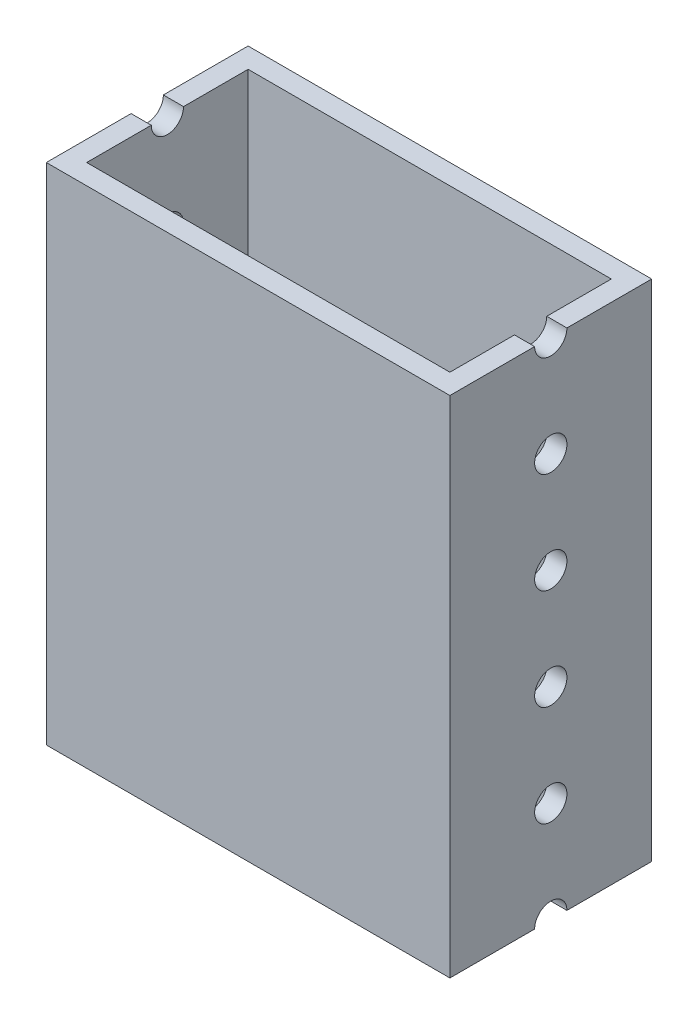
ISO-10303-21;
HEADER;
FILE_DESCRIPTION(('STEP AP214'),'2;1');
FILE_NAME('part.step','',(''),(''),'','','');
FILE_SCHEMA(('AUTOMOTIVE_DESIGN { 1 0 10303 214 1 1 1 1 }'));
ENDSEC;
DATA;
#1=APPLICATION_CONTEXT('core data for automotive mechanical design processes');
#2=APPLICATION_PROTOCOL_DEFINITION('international standard','automotive_design',2000,#1);
#3=PRODUCT_CONTEXT('',#1,'mechanical');
#4=PRODUCT('Part','Part','',(#3));
#5=PRODUCT_RELATED_PRODUCT_CATEGORY('part','',(#4));
#6=PRODUCT_DEFINITION_FORMATION('','',#4);
#7=PRODUCT_DEFINITION_CONTEXT('part definition',#1,'design');
#8=PRODUCT_DEFINITION('design','',#6,#7);
#9=PRODUCT_DEFINITION_SHAPE('','',#8);
#10=(LENGTH_UNIT() NAMED_UNIT(*) SI_UNIT(.MILLI.,.METRE.));
#11=(NAMED_UNIT(*) PLANE_ANGLE_UNIT() SI_UNIT($,.RADIAN.));
#12=(NAMED_UNIT(*) SI_UNIT($,.STERADIAN.) SOLID_ANGLE_UNIT());
#13=UNCERTAINTY_MEASURE_WITH_UNIT(LENGTH_MEASURE(1.E-05),#10,'distance_accuracy_value','');
#14=(GEOMETRIC_REPRESENTATION_CONTEXT(3) GLOBAL_UNCERTAINTY_ASSIGNED_CONTEXT((#13)) GLOBAL_UNIT_ASSIGNED_CONTEXT((#10,
#11,#12)) REPRESENTATION_CONTEXT('',''));
#15=CARTESIAN_POINT('',(0.,0.,0.));
#16=DIRECTION('',(0.,0.,1.));
#17=DIRECTION('',(1.,0.,0.));
#18=AXIS2_PLACEMENT_3D('',#15,#16,#17);
#19=CARTESIAN_POINT('',(25.4,635.,12.7));
#20=DIRECTION('',(-1.,0.,0.));
#21=DIRECTION('',(0.,0.,1.));
#22=AXIS2_PLACEMENT_3D('',#19,#20,#21);
#23=PLANE('',#22);
#24=CARTESIAN_POINT('',(25.4,50.8,0.));
#25=DIRECTION('',(1.,0.,0.));
#26=DIRECTION('',(0.,0.,-1.));
#27=AXIS2_PLACEMENT_3D('',#24,#25,#26);
#28=CIRCLE('',#27,2.032);
#29=CARTESIAN_POINT('',(25.4,50.8,-2.032));
#30=VERTEX_POINT('',#29);
#31=EDGE_CURVE('E302',#30,#30,#28,.T.);
#32=ORIENTED_EDGE('',*,*,#31,.F.);
#33=EDGE_LOOP('',(#32));
#34=FACE_BOUND('',#33,.T.);
#35=CARTESIAN_POINT('',(25.4,38.1,0.));
#36=DIRECTION('',(1.,0.,0.));
#37=DIRECTION('',(0.,0.,-1.));
#38=AXIS2_PLACEMENT_3D('',#35,#36,#37);
#39=CIRCLE('',#38,2.032);
#40=CARTESIAN_POINT('',(25.4,38.1,-2.032));
#41=VERTEX_POINT('',#40);
#42=EDGE_CURVE('E326',#41,#41,#39,.T.);
#43=ORIENTED_EDGE('',*,*,#42,.F.);
#44=EDGE_LOOP('',(#43));
#45=FACE_BOUND('',#44,.T.);
#46=CARTESIAN_POINT('',(25.4,25.4,0.));
#47=DIRECTION('',(1.,0.,0.));
#48=DIRECTION('',(0.,0.,-1.));
#49=AXIS2_PLACEMENT_3D('',#46,#47,#48);
#50=CIRCLE('',#49,2.032);
#51=CARTESIAN_POINT('',(25.4,25.4,-2.032));
#52=VERTEX_POINT('',#51);
#53=EDGE_CURVE('E320',#52,#52,#50,.T.);
#54=ORIENTED_EDGE('',*,*,#53,.F.);
#55=EDGE_LOOP('',(#54));
#56=FACE_BOUND('',#55,.T.);
#57=CARTESIAN_POINT('',(25.4,12.7,0.));
#58=DIRECTION('',(1.,0.,0.));
#59=DIRECTION('',(0.,0.,-1.));
#60=AXIS2_PLACEMENT_3D('',#57,#58,#59);
#61=CIRCLE('',#60,2.032);
#62=CARTESIAN_POINT('',(25.4,12.7,-2.032));
#63=VERTEX_POINT('',#62);
#64=EDGE_CURVE('E314',#63,#63,#61,.T.);
#65=ORIENTED_EDGE('',*,*,#64,.F.);
#66=EDGE_LOOP('',(#65));
#67=FACE_BOUND('',#66,.T.);
#68=DIRECTION('',(0.,0.,-1.));
#69=VECTOR('',#68,1.);
#70=CARTESIAN_POINT('',(25.4,63.5,12.7));
#71=LINE('',#70,#69);
#72=CARTESIAN_POINT('',(25.4,63.5,12.7));
#73=VERTEX_POINT('',#72);
#74=CARTESIAN_POINT('',(25.4,63.5,2.032));
#75=VERTEX_POINT('',#74);
#76=EDGE_CURVE('E144',#73,#75,#71,.T.);
#77=ORIENTED_EDGE('',*,*,#76,.F.);
#78=DIRECTION('',(0.,-1.,0.));
#79=VECTOR('',#78,1.);
#80=CARTESIAN_POINT('',(25.4,635.,12.7));
#81=LINE('',#80,#79);
#82=CARTESIAN_POINT('',(25.4,0.,12.7));
#83=VERTEX_POINT('',#82);
#84=EDGE_CURVE('E156',#73,#83,#81,.T.);
#85=ORIENTED_EDGE('',*,*,#84,.T.);
#86=DIRECTION('',(0.,0.,-1.));
#87=VECTOR('',#86,1.);
#88=CARTESIAN_POINT('',(25.4,0.,12.7));
#89=LINE('',#88,#87);
#90=CARTESIAN_POINT('',(25.4,0.,2.032));
#91=VERTEX_POINT('',#90);
#92=EDGE_CURVE('E264',#83,#91,#89,.T.);
#93=ORIENTED_EDGE('',*,*,#92,.T.);
#94=CARTESIAN_POINT('',(25.4,0.,0.));
#95=DIRECTION('',(1.,0.,0.));
#96=DIRECTION('',(0.,0.,-1.));
#97=AXIS2_PLACEMENT_3D('',#94,#95,#96);
#98=CIRCLE('',#97,2.032);
#99=CARTESIAN_POINT('',(25.4,0.,-2.032));
#100=VERTEX_POINT('',#99);
#101=EDGE_CURVE('E229',#100,#91,#98,.T.);
#102=ORIENTED_EDGE('',*,*,#101,.F.);
#103=CARTESIAN_POINT('',(25.4,0.,-12.7));
#104=VERTEX_POINT('',#103);
#105=EDGE_CURVE('E263',#100,#104,#89,.T.);
#106=ORIENTED_EDGE('',*,*,#105,.T.);
#107=DIRECTION('',(0.,-1.,0.));
#108=VECTOR('',#107,1.);
#109=CARTESIAN_POINT('',(25.4,635.,-12.7));
#110=LINE('',#109,#108);
#111=CARTESIAN_POINT('',(25.4,63.5,-12.7));
#112=VERTEX_POINT('',#111);
#113=EDGE_CURVE('E176',#112,#104,#110,.T.);
#114=ORIENTED_EDGE('',*,*,#113,.F.);
#115=CARTESIAN_POINT('',(25.4,63.5,-2.032));
#116=VERTEX_POINT('',#115);
#117=EDGE_CURVE('E151',#116,#112,#71,.T.);
#118=ORIENTED_EDGE('',*,*,#117,.F.);
#119=CARTESIAN_POINT('',(25.4,63.5,0.));
#120=DIRECTION('',(1.,0.,0.));
#121=DIRECTION('',(0.,0.,-1.));
#122=AXIS2_PLACEMENT_3D('',#119,#120,#121);
#123=CIRCLE('',#122,2.032);
#124=EDGE_CURVE('E160',#75,#116,#123,.T.);
#125=ORIENTED_EDGE('',*,*,#124,.F.);
#126=EDGE_LOOP('',(#77,#85,#93,#102,#106,#114,#118,#125));
#127=FACE_BOUND('',#126,.T.);
#128=ADVANCED_FACE('F32',(#34,#45,#56,#67,#127),#23,.F.);
#129=CARTESIAN_POINT('',(-25.4,635.,-12.7));
#130=DIRECTION('',(0.,0.,1.));
#131=DIRECTION('',(1.,0.,0.));
#132=AXIS2_PLACEMENT_3D('',#129,#130,#131);
#133=PLANE('',#132);
#134=DIRECTION('',(-1.,0.,0.));
#135=VECTOR('',#134,1.);
#136=CARTESIAN_POINT('',(25.4,63.5,-12.7));
#137=LINE('',#136,#135);
#138=CARTESIAN_POINT('',(-25.4,63.5,-12.7));
#139=VERTEX_POINT('',#138);
#140=EDGE_CURVE('E161',#112,#139,#137,.T.);
#141=ORIENTED_EDGE('',*,*,#140,.F.);
#142=ORIENTED_EDGE('',*,*,#113,.T.);
#143=DIRECTION('',(-1.,0.,0.));
#144=VECTOR('',#143,1.);
#145=CARTESIAN_POINT('',(-25.4,0.,-12.7));
#146=LINE('',#145,#144);
#147=CARTESIAN_POINT('',(-25.4,0.,-12.7));
#148=VERTEX_POINT('',#147);
#149=EDGE_CURVE('E266',#104,#148,#146,.T.);
#150=ORIENTED_EDGE('',*,*,#149,.T.);
#151=DIRECTION('',(0.,-1.,0.));
#152=VECTOR('',#151,1.);
#153=CARTESIAN_POINT('',(-25.4,635.,-12.7));
#154=LINE('',#153,#152);
#155=EDGE_CURVE('E169',#139,#148,#154,.T.);
#156=ORIENTED_EDGE('',*,*,#155,.F.);
#157=EDGE_LOOP('',(#141,#142,#150,#156));
#158=FACE_BOUND('',#157,.T.);
#159=ADVANCED_FACE('F294',(#158),#133,.F.);
#160=CARTESIAN_POINT('',(-25.4,635.,12.7));
#161=DIRECTION('',(1.,0.,0.));
#162=DIRECTION('',(0.,0.,-1.));
#163=AXIS2_PLACEMENT_3D('',#160,#161,#162);
#164=PLANE('',#163);
#165=CARTESIAN_POINT('',(-25.4,50.8,0.));
#166=DIRECTION('',(1.,0.,0.));
#167=DIRECTION('',(0.,0.,-1.));
#168=AXIS2_PLACEMENT_3D('',#165,#166,#167);
#169=CIRCLE('',#168,2.032);
#170=CARTESIAN_POINT('',(-25.4,50.8,-2.032));
#171=VERTEX_POINT('',#170);
#172=EDGE_CURVE('E329',#171,#171,#169,.T.);
#173=ORIENTED_EDGE('',*,*,#172,.T.);
#174=EDGE_LOOP('',(#173));
#175=FACE_BOUND('',#174,.T.);
#176=CARTESIAN_POINT('',(-25.4,38.1,0.));
#177=DIRECTION('',(1.,0.,0.));
#178=DIRECTION('',(0.,0.,-1.));
#179=AXIS2_PLACEMENT_3D('',#176,#177,#178);
#180=CIRCLE('',#179,2.032);
#181=CARTESIAN_POINT('',(-25.4,38.1,-2.032));
#182=VERTEX_POINT('',#181);
#183=EDGE_CURVE('E323',#182,#182,#180,.T.);
#184=ORIENTED_EDGE('',*,*,#183,.T.);
#185=EDGE_LOOP('',(#184));
#186=FACE_BOUND('',#185,.T.);
#187=CARTESIAN_POINT('',(-25.4,25.4,0.));
#188=DIRECTION('',(1.,0.,0.));
#189=DIRECTION('',(0.,0.,-1.));
#190=AXIS2_PLACEMENT_3D('',#187,#188,#189);
#191=CIRCLE('',#190,2.032);
#192=CARTESIAN_POINT('',(-25.4,25.4,-2.032));
#193=VERTEX_POINT('',#192);
#194=EDGE_CURVE('E317',#193,#193,#191,.T.);
#195=ORIENTED_EDGE('',*,*,#194,.T.);
#196=EDGE_LOOP('',(#195));
#197=FACE_BOUND('',#196,.T.);
#198=CARTESIAN_POINT('',(-25.4,12.7,0.));
#199=DIRECTION('',(1.,0.,0.));
#200=DIRECTION('',(0.,0.,-1.));
#201=AXIS2_PLACEMENT_3D('',#198,#199,#200);
#202=CIRCLE('',#201,2.032);
#203=CARTESIAN_POINT('',(-25.4,12.7,-2.032));
#204=VERTEX_POINT('',#203);
#205=EDGE_CURVE('E184',#204,#204,#202,.T.);
#206=ORIENTED_EDGE('',*,*,#205,.T.);
#207=EDGE_LOOP('',(#206));
#208=FACE_BOUND('',#207,.T.);
#209=DIRECTION('',(0.,0.,1.));
#210=VECTOR('',#209,1.);
#211=CARTESIAN_POINT('',(-25.4,63.5,-12.7));
#212=LINE('',#211,#210);
#213=CARTESIAN_POINT('',(-25.4,63.5,-2.032));
#214=VERTEX_POINT('',#213);
#215=EDGE_CURVE('E46',#139,#214,#212,.T.);
#216=ORIENTED_EDGE('',*,*,#215,.F.);
#217=ORIENTED_EDGE('',*,*,#155,.T.);
#218=DIRECTION('',(0.,0.,1.));
#219=VECTOR('',#218,1.);
#220=CARTESIAN_POINT('',(-25.4,0.,12.7));
#221=LINE('',#220,#219);
#222=CARTESIAN_POINT('',(-25.4,0.,-2.032));
#223=VERTEX_POINT('',#222);
#224=EDGE_CURVE('E171',#148,#223,#221,.T.);
#225=ORIENTED_EDGE('',*,*,#224,.T.);
#226=CARTESIAN_POINT('',(-25.4,0.,0.));
#227=DIRECTION('',(1.,0.,0.));
#228=DIRECTION('',(0.,0.,-1.));
#229=AXIS2_PLACEMENT_3D('',#226,#227,#228);
#230=CIRCLE('',#229,2.032);
#231=CARTESIAN_POINT('',(-25.4,0.,2.032));
#232=VERTEX_POINT('',#231);
#233=EDGE_CURVE('E230',#223,#232,#230,.T.);
#234=ORIENTED_EDGE('',*,*,#233,.T.);
#235=CARTESIAN_POINT('',(-25.4,0.,12.7));
#236=VERTEX_POINT('',#235);
#237=EDGE_CURVE('E268',#232,#236,#221,.T.);
#238=ORIENTED_EDGE('',*,*,#237,.T.);
#239=DIRECTION('',(0.,-1.,0.));
#240=VECTOR('',#239,1.);
#241=CARTESIAN_POINT('',(-25.4,635.,12.7));
#242=LINE('',#241,#240);
#243=CARTESIAN_POINT('',(-25.4,63.5,12.7));
#244=VERTEX_POINT('',#243);
#245=EDGE_CURVE('E167',#244,#236,#242,.T.);
#246=ORIENTED_EDGE('',*,*,#245,.F.);
#247=CARTESIAN_POINT('',(-25.4,63.5,2.032));
#248=VERTEX_POINT('',#247);
#249=EDGE_CURVE('E147',#248,#244,#212,.T.);
#250=ORIENTED_EDGE('',*,*,#249,.F.);
#251=CARTESIAN_POINT('',(-25.4,63.5,0.));
#252=DIRECTION('',(1.,0.,0.));
#253=DIRECTION('',(0.,0.,-1.));
#254=AXIS2_PLACEMENT_3D('',#251,#252,#253);
#255=CIRCLE('',#254,2.032);
#256=EDGE_CURVE('E301',#248,#214,#255,.T.);
#257=ORIENTED_EDGE('',*,*,#256,.T.);
#258=EDGE_LOOP('',(#216,#217,#225,#234,#238,#246,#250,#257));
#259=FACE_BOUND('',#258,.T.);
#260=ADVANCED_FACE('F274',(#175,#186,#197,#208,#259),#164,.F.);
#261=CARTESIAN_POINT('',(-25.4,635.,12.7));
#262=DIRECTION('',(0.,0.,-1.));
#263=DIRECTION('',(-1.,0.,0.));
#264=AXIS2_PLACEMENT_3D('',#261,#262,#263);
#265=PLANE('',#264);
#266=DIRECTION('',(1.,0.,0.));
#267=VECTOR('',#266,1.);
#268=CARTESIAN_POINT('',(-25.4,63.5,12.7));
#269=LINE('',#268,#267);
#270=EDGE_CURVE('E141',#244,#73,#269,.T.);
#271=ORIENTED_EDGE('',*,*,#270,.F.);
#272=ORIENTED_EDGE('',*,*,#245,.T.);
#273=DIRECTION('',(1.,0.,0.));
#274=VECTOR('',#273,1.);
#275=CARTESIAN_POINT('',(-25.4,0.,12.7));
#276=LINE('',#275,#274);
#277=EDGE_CURVE('E165',#236,#83,#276,.T.);
#278=ORIENTED_EDGE('',*,*,#277,.T.);
#279=ORIENTED_EDGE('',*,*,#84,.F.);
#280=EDGE_LOOP('',(#271,#272,#278,#279));
#281=FACE_BOUND('',#280,.T.);
#282=ADVANCED_FACE('F163',(#281),#265,.F.);
#283=CARTESIAN_POINT('',(-22.86,635.,10.16));
#284=DIRECTION('',(1.,0.,0.));
#285=DIRECTION('',(0.,0.,-1.));
#286=AXIS2_PLACEMENT_3D('',#283,#284,#285);
#287=PLANE('',#286);
#288=CARTESIAN_POINT('',(-22.86,50.8,0.));
#289=DIRECTION('',(1.,0.,0.));
#290=DIRECTION('',(0.,0.,-1.));
#291=AXIS2_PLACEMENT_3D('',#288,#289,#290);
#292=CIRCLE('',#291,2.032);
#293=CARTESIAN_POINT('',(-22.86,50.8,-2.032));
#294=VERTEX_POINT('',#293);
#295=EDGE_CURVE('E188',#294,#294,#292,.T.);
#296=ORIENTED_EDGE('',*,*,#295,.F.);
#297=EDGE_LOOP('',(#296));
#298=FACE_BOUND('',#297,.T.);
#299=CARTESIAN_POINT('',(-22.86,38.1,0.));
#300=DIRECTION('',(1.,0.,0.));
#301=DIRECTION('',(0.,0.,-1.));
#302=AXIS2_PLACEMENT_3D('',#299,#300,#301);
#303=CIRCLE('',#302,2.032);
#304=CARTESIAN_POINT('',(-22.86,38.1,-2.032));
#305=VERTEX_POINT('',#304);
#306=EDGE_CURVE('E192',#305,#305,#303,.T.);
#307=ORIENTED_EDGE('',*,*,#306,.F.);
#308=EDGE_LOOP('',(#307));
#309=FACE_BOUND('',#308,.T.);
#310=CARTESIAN_POINT('',(-22.86,25.4,0.));
#311=DIRECTION('',(1.,0.,0.));
#312=DIRECTION('',(0.,0.,-1.));
#313=AXIS2_PLACEMENT_3D('',#310,#311,#312);
#314=CIRCLE('',#313,2.032);
#315=CARTESIAN_POINT('',(-22.86,25.4,-2.032));
#316=VERTEX_POINT('',#315);
#317=EDGE_CURVE('E196',#316,#316,#314,.T.);
#318=ORIENTED_EDGE('',*,*,#317,.F.);
#319=EDGE_LOOP('',(#318));
#320=FACE_BOUND('',#319,.T.);
#321=CARTESIAN_POINT('',(-22.86,12.7,0.));
#322=DIRECTION('',(1.,0.,0.));
#323=DIRECTION('',(0.,0.,-1.));
#324=AXIS2_PLACEMENT_3D('',#321,#322,#323);
#325=CIRCLE('',#324,2.032);
#326=CARTESIAN_POINT('',(-22.86,12.7,-2.032));
#327=VERTEX_POINT('',#326);
#328=EDGE_CURVE('E199',#327,#327,#325,.T.);
#329=ORIENTED_EDGE('',*,*,#328,.F.);
#330=EDGE_LOOP('',(#329));
#331=FACE_BOUND('',#330,.T.);
#332=DIRECTION('',(0.,-1.,0.));
#333=VECTOR('',#332,1.);
#334=CARTESIAN_POINT('',(-22.86,635.,-10.16));
#335=LINE('',#334,#333);
#336=CARTESIAN_POINT('',(-22.86,63.5,-10.16));
#337=VERTEX_POINT('',#336);
#338=CARTESIAN_POINT('',(-22.86,0.,-10.16));
#339=VERTEX_POINT('',#338);
#340=EDGE_CURVE('E213',#337,#339,#335,.T.);
#341=ORIENTED_EDGE('',*,*,#340,.F.);
#342=DIRECTION('',(0.,0.,1.));
#343=VECTOR('',#342,1.);
#344=CARTESIAN_POINT('',(-22.86,63.5,10.16));
#345=LINE('',#344,#343);
#346=CARTESIAN_POINT('',(-22.86,63.5,-2.032));
#347=VERTEX_POINT('',#346);
#348=EDGE_CURVE('E202',#337,#347,#345,.T.);
#349=ORIENTED_EDGE('',*,*,#348,.T.);
#350=CARTESIAN_POINT('',(-22.86,63.5,0.));
#351=DIRECTION('',(1.,0.,0.));
#352=DIRECTION('',(0.,0.,-1.));
#353=AXIS2_PLACEMENT_3D('',#350,#351,#352);
#354=CIRCLE('',#353,2.032);
#355=CARTESIAN_POINT('',(-22.86,63.5,2.032));
#356=VERTEX_POINT('',#355);
#357=EDGE_CURVE('E183',#356,#347,#354,.T.);
#358=ORIENTED_EDGE('',*,*,#357,.F.);
#359=CARTESIAN_POINT('',(-22.86,63.5,10.16));
#360=VERTEX_POINT('',#359);
#361=EDGE_CURVE('E53',#356,#360,#345,.T.);
#362=ORIENTED_EDGE('',*,*,#361,.T.);
#363=DIRECTION('',(0.,-1.,0.));
#364=VECTOR('',#363,1.);
#365=CARTESIAN_POINT('',(-22.86,635.,10.16));
#366=LINE('',#365,#364);
#367=CARTESIAN_POINT('',(-22.86,0.,10.16));
#368=VERTEX_POINT('',#367);
#369=EDGE_CURVE('E261',#360,#368,#366,.T.);
#370=ORIENTED_EDGE('',*,*,#369,.T.);
#371=DIRECTION('',(0.,0.,1.));
#372=VECTOR('',#371,1.);
#373=CARTESIAN_POINT('',(-22.86,0.,10.16));
#374=LINE('',#373,#372);
#375=CARTESIAN_POINT('',(-22.86,0.,2.032));
#376=VERTEX_POINT('',#375);
#377=EDGE_CURVE('E246',#376,#368,#374,.T.);
#378=ORIENTED_EDGE('',*,*,#377,.F.);
#379=CARTESIAN_POINT('',(-22.86,0.,0.));
#380=DIRECTION('',(1.,0.,0.));
#381=DIRECTION('',(0.,0.,-1.));
#382=AXIS2_PLACEMENT_3D('',#379,#380,#381);
#383=CIRCLE('',#382,2.032);
#384=CARTESIAN_POINT('',(-22.86,0.,-2.032));
#385=VERTEX_POINT('',#384);
#386=EDGE_CURVE('E239',#385,#376,#383,.T.);
#387=ORIENTED_EDGE('',*,*,#386,.F.);
#388=EDGE_CURVE('E242',#339,#385,#374,.T.);
#389=ORIENTED_EDGE('',*,*,#388,.F.);
#390=EDGE_LOOP('',(#341,#349,#358,#362,#370,#378,#387,#389));
#391=FACE_BOUND('',#390,.T.);
#392=ADVANCED_FACE('F211',(#298,#309,#320,#331,#391),#287,.T.);
#393=CARTESIAN_POINT('',(-22.86,635.,10.16));
#394=DIRECTION('',(0.,0.,-1.));
#395=DIRECTION('',(-1.,0.,0.));
#396=AXIS2_PLACEMENT_3D('',#393,#394,#395);
#397=PLANE('',#396);
#398=ORIENTED_EDGE('',*,*,#369,.F.);
#399=DIRECTION('',(1.,0.,0.));
#400=VECTOR('',#399,1.);
#401=CARTESIAN_POINT('',(-22.86,63.5,10.16));
#402=LINE('',#401,#400);
#403=CARTESIAN_POINT('',(22.86,63.5,10.16));
#404=VERTEX_POINT('',#403);
#405=EDGE_CURVE('E306',#360,#404,#402,.T.);
#406=ORIENTED_EDGE('',*,*,#405,.T.);
#407=DIRECTION('',(0.,-1.,0.));
#408=VECTOR('',#407,1.);
#409=CARTESIAN_POINT('',(22.86,635.,10.16));
#410=LINE('',#409,#408);
#411=CARTESIAN_POINT('',(22.86,0.,10.16));
#412=VERTEX_POINT('',#411);
#413=EDGE_CURVE('E259',#404,#412,#410,.T.);
#414=ORIENTED_EDGE('',*,*,#413,.T.);
#415=DIRECTION('',(1.,0.,0.));
#416=VECTOR('',#415,1.);
#417=CARTESIAN_POINT('',(-22.86,0.,10.16));
#418=LINE('',#417,#416);
#419=EDGE_CURVE('E245',#368,#412,#418,.T.);
#420=ORIENTED_EDGE('',*,*,#419,.F.);
#421=EDGE_LOOP('',(#398,#406,#414,#420));
#422=FACE_BOUND('',#421,.T.);
#423=ADVANCED_FACE('F390',(#422),#397,.T.);
#424=CARTESIAN_POINT('',(22.86,635.,10.16));
#425=DIRECTION('',(-1.,0.,0.));
#426=DIRECTION('',(0.,0.,1.));
#427=AXIS2_PLACEMENT_3D('',#424,#425,#426);
#428=PLANE('',#427);
#429=CARTESIAN_POINT('',(22.86,50.8,0.));
#430=DIRECTION('',(-1.,0.,0.));
#431=DIRECTION('',(0.,0.,1.));
#432=AXIS2_PLACEMENT_3D('',#429,#430,#431);
#433=CIRCLE('',#432,2.032);
#434=CARTESIAN_POINT('',(22.86,50.8,2.032));
#435=VERTEX_POINT('',#434);
#436=EDGE_CURVE('E185',#435,#435,#433,.T.);
#437=ORIENTED_EDGE('',*,*,#436,.F.);
#438=EDGE_LOOP('',(#437));
#439=FACE_BOUND('',#438,.T.);
#440=CARTESIAN_POINT('',(22.86,38.1,0.));
#441=DIRECTION('',(-1.,0.,0.));
#442=DIRECTION('',(0.,0.,1.));
#443=AXIS2_PLACEMENT_3D('',#440,#441,#442);
#444=CIRCLE('',#443,2.032);
#445=CARTESIAN_POINT('',(22.86,38.1,2.032));
#446=VERTEX_POINT('',#445);
#447=EDGE_CURVE('E189',#446,#446,#444,.T.);
#448=ORIENTED_EDGE('',*,*,#447,.F.);
#449=EDGE_LOOP('',(#448));
#450=FACE_BOUND('',#449,.T.);
#451=CARTESIAN_POINT('',(22.86,25.4,0.));
#452=DIRECTION('',(-1.,0.,0.));
#453=DIRECTION('',(0.,0.,1.));
#454=AXIS2_PLACEMENT_3D('',#451,#452,#453);
#455=CIRCLE('',#454,2.032);
#456=CARTESIAN_POINT('',(22.86,25.4,2.032));
#457=VERTEX_POINT('',#456);
#458=EDGE_CURVE('E193',#457,#457,#455,.T.);
#459=ORIENTED_EDGE('',*,*,#458,.F.);
#460=EDGE_LOOP('',(#459));
#461=FACE_BOUND('',#460,.T.);
#462=CARTESIAN_POINT('',(22.86,12.7,0.));
#463=DIRECTION('',(-1.,0.,0.));
#464=DIRECTION('',(0.,0.,1.));
#465=AXIS2_PLACEMENT_3D('',#462,#463,#464);
#466=CIRCLE('',#465,2.032);
#467=CARTESIAN_POINT('',(22.86,12.7,2.032));
#468=VERTEX_POINT('',#467);
#469=EDGE_CURVE('E197',#468,#468,#466,.T.);
#470=ORIENTED_EDGE('',*,*,#469,.F.);
#471=EDGE_LOOP('',(#470));
#472=FACE_BOUND('',#471,.T.);
#473=ORIENTED_EDGE('',*,*,#413,.F.);
#474=DIRECTION('',(0.,0.,-1.));
#475=VECTOR('',#474,1.);
#476=CARTESIAN_POINT('',(22.86,63.5,10.16));
#477=LINE('',#476,#475);
#478=CARTESIAN_POINT('',(22.86,63.5,2.032));
#479=VERTEX_POINT('',#478);
#480=EDGE_CURVE('E303',#404,#479,#477,.T.);
#481=ORIENTED_EDGE('',*,*,#480,.T.);
#482=CARTESIAN_POINT('',(22.86,63.5,0.));
#483=DIRECTION('',(-1.,0.,0.));
#484=DIRECTION('',(0.,0.,1.));
#485=AXIS2_PLACEMENT_3D('',#482,#483,#484);
#486=CIRCLE('',#485,2.032);
#487=CARTESIAN_POINT('',(22.86,63.5,-2.032));
#488=VERTEX_POINT('',#487);
#489=EDGE_CURVE('E180',#488,#479,#486,.T.);
#490=ORIENTED_EDGE('',*,*,#489,.F.);
#491=CARTESIAN_POINT('',(22.86,63.5,-10.16));
#492=VERTEX_POINT('',#491);
#493=EDGE_CURVE('E308',#488,#492,#477,.T.);
#494=ORIENTED_EDGE('',*,*,#493,.T.);
#495=DIRECTION('',(0.,-1.,0.));
#496=VECTOR('',#495,1.);
#497=CARTESIAN_POINT('',(22.86,635.,-10.16));
#498=LINE('',#497,#496);
#499=CARTESIAN_POINT('',(22.86,0.,-10.16));
#500=VERTEX_POINT('',#499);
#501=EDGE_CURVE('E257',#492,#500,#498,.T.);
#502=ORIENTED_EDGE('',*,*,#501,.T.);
#503=DIRECTION('',(0.,0.,-1.));
#504=VECTOR('',#503,1.);
#505=CARTESIAN_POINT('',(22.86,0.,10.16));
#506=LINE('',#505,#504);
#507=CARTESIAN_POINT('',(22.86,0.,-2.032));
#508=VERTEX_POINT('',#507);
#509=EDGE_CURVE('E249',#508,#500,#506,.T.);
#510=ORIENTED_EDGE('',*,*,#509,.F.);
#511=CARTESIAN_POINT('',(22.86,0.,0.));
#512=DIRECTION('',(-1.,0.,0.));
#513=DIRECTION('',(0.,0.,1.));
#514=AXIS2_PLACEMENT_3D('',#511,#512,#513);
#515=CIRCLE('',#514,2.032);
#516=CARTESIAN_POINT('',(22.86,0.,2.032));
#517=VERTEX_POINT('',#516);
#518=EDGE_CURVE('E178',#517,#508,#515,.T.);
#519=ORIENTED_EDGE('',*,*,#518,.F.);
#520=EDGE_CURVE('E250',#412,#517,#506,.T.);
#521=ORIENTED_EDGE('',*,*,#520,.F.);
#522=EDGE_LOOP('',(#473,#481,#490,#494,#502,#510,#519,#521));
#523=FACE_BOUND('',#522,.T.);
#524=ADVANCED_FACE('F394',(#439,#450,#461,#472,#523),#428,.T.);
#525=CARTESIAN_POINT('',(-22.86,635.,-10.16));
#526=DIRECTION('',(0.,0.,1.));
#527=DIRECTION('',(1.,0.,0.));
#528=AXIS2_PLACEMENT_3D('',#525,#526,#527);
#529=PLANE('',#528);
#530=ORIENTED_EDGE('',*,*,#501,.F.);
#531=DIRECTION('',(-1.,0.,0.));
#532=VECTOR('',#531,1.);
#533=CARTESIAN_POINT('',(-22.86,63.5,-10.16));
#534=LINE('',#533,#532);
#535=EDGE_CURVE('E214',#492,#337,#534,.T.);
#536=ORIENTED_EDGE('',*,*,#535,.T.);
#537=ORIENTED_EDGE('',*,*,#340,.T.);
#538=DIRECTION('',(-1.,0.,0.));
#539=VECTOR('',#538,1.);
#540=CARTESIAN_POINT('',(-22.86,0.,-10.16));
#541=LINE('',#540,#539);
#542=EDGE_CURVE('E253',#500,#339,#541,.T.);
#543=ORIENTED_EDGE('',*,*,#542,.F.);
#544=EDGE_LOOP('',(#530,#536,#537,#543));
#545=FACE_BOUND('',#544,.T.);
#546=ADVANCED_FACE('F398',(#545),#529,.T.);
#547=CARTESIAN_POINT('',(-25.4,63.5,0.));
#548=DIRECTION('',(1.,0.,0.));
#549=DIRECTION('',(0.,0.,-1.));
#550=AXIS2_PLACEMENT_3D('',#547,#548,#549);
#551=CYLINDRICAL_SURFACE('',#550,2.032);
#552=DIRECTION('',(1.,0.,0.));
#553=VECTOR('',#552,1.);
#554=CARTESIAN_POINT('',(-25.4,63.5,2.032));
#555=LINE('',#554,#553);
#556=EDGE_CURVE('E300',#75,#479,#555,.F.);
#557=ORIENTED_EDGE('',*,*,#556,.F.);
#558=ORIENTED_EDGE('',*,*,#124,.T.);
#559=DIRECTION('',(1.,0.,0.));
#560=VECTOR('',#559,1.);
#561=CARTESIAN_POINT('',(-25.4,63.5,-2.032));
#562=LINE('',#561,#560);
#563=EDGE_CURVE('E298',#488,#116,#562,.T.);
#564=ORIENTED_EDGE('',*,*,#563,.F.);
#565=ORIENTED_EDGE('',*,*,#489,.T.);
#566=EDGE_LOOP('',(#557,#558,#564,#565));
#567=FACE_BOUND('',#566,.T.);
#568=ADVANCED_FACE('F297',(#567),#551,.F.);
#569=DIRECTION('',(1.,0.,0.));
#570=VECTOR('',#569,1.);
#571=CARTESIAN_POINT('',(-25.4,63.5,2.032));
#572=LINE('',#571,#570);
#573=EDGE_CURVE('E11',#356,#248,#572,.F.);
#574=ORIENTED_EDGE('',*,*,#573,.F.);
#575=ORIENTED_EDGE('',*,*,#357,.T.);
#576=DIRECTION('',(1.,0.,0.));
#577=VECTOR('',#576,1.);
#578=CARTESIAN_POINT('',(-25.4,63.5,-2.032));
#579=LINE('',#578,#577);
#580=EDGE_CURVE('E39',#214,#347,#579,.T.);
#581=ORIENTED_EDGE('',*,*,#580,.F.);
#582=ORIENTED_EDGE('',*,*,#256,.F.);
#583=EDGE_LOOP('',(#574,#575,#581,#582));
#584=FACE_BOUND('',#583,.T.);
#585=ADVANCED_FACE('F216',(#584),#551,.F.);
#586=CARTESIAN_POINT('',(0.,0.,0.));
#587=DIRECTION('',(0.,-1.,0.));
#588=DIRECTION('',(0.,0.,-1.));
#589=AXIS2_PLACEMENT_3D('',#586,#587,#588);
#590=PLANE('',#589);
#591=DIRECTION('',(1.,0.,0.));
#592=VECTOR('',#591,1.);
#593=CARTESIAN_POINT('',(-25.4,0.,-2.032));
#594=LINE('',#593,#592);
#595=EDGE_CURVE('E240',#223,#385,#594,.T.);
#596=ORIENTED_EDGE('',*,*,#595,.F.);
#597=ORIENTED_EDGE('',*,*,#224,.F.);
#598=ORIENTED_EDGE('',*,*,#149,.F.);
#599=ORIENTED_EDGE('',*,*,#105,.F.);
#600=EDGE_CURVE('E236',#508,#100,#594,.T.);
#601=ORIENTED_EDGE('',*,*,#600,.F.);
#602=ORIENTED_EDGE('',*,*,#509,.T.);
#603=ORIENTED_EDGE('',*,*,#542,.T.);
#604=ORIENTED_EDGE('',*,*,#388,.T.);
#605=EDGE_LOOP('',(#596,#597,#598,#599,#601,#602,#603,#604));
#606=FACE_BOUND('',#605,.T.);
#607=ADVANCED_FACE('F288',(#606),#590,.T.);
#608=DIRECTION('',(1.,0.,0.));
#609=VECTOR('',#608,1.);
#610=CARTESIAN_POINT('',(-25.4,0.,2.032));
#611=LINE('',#610,#609);
#612=EDGE_CURVE('E233',#91,#517,#611,.F.);
#613=ORIENTED_EDGE('',*,*,#612,.F.);
#614=ORIENTED_EDGE('',*,*,#92,.F.);
#615=ORIENTED_EDGE('',*,*,#277,.F.);
#616=ORIENTED_EDGE('',*,*,#237,.F.);
#617=EDGE_CURVE('E237',#376,#232,#611,.F.);
#618=ORIENTED_EDGE('',*,*,#617,.F.);
#619=ORIENTED_EDGE('',*,*,#377,.T.);
#620=ORIENTED_EDGE('',*,*,#419,.T.);
#621=ORIENTED_EDGE('',*,*,#520,.T.);
#622=EDGE_LOOP('',(#613,#614,#615,#616,#618,#619,#620,#621));
#623=FACE_BOUND('',#622,.T.);
#624=ADVANCED_FACE('F278',(#623),#590,.T.);
#625=CARTESIAN_POINT('',(-25.4,0.,0.));
#626=DIRECTION('',(1.,0.,0.));
#627=DIRECTION('',(0.,0.,-1.));
#628=AXIS2_PLACEMENT_3D('',#625,#626,#627);
#629=CYLINDRICAL_SURFACE('',#628,2.032);
#630=ORIENTED_EDGE('',*,*,#600,.T.);
#631=ORIENTED_EDGE('',*,*,#101,.T.);
#632=ORIENTED_EDGE('',*,*,#612,.T.);
#633=ORIENTED_EDGE('',*,*,#518,.T.);
#634=EDGE_LOOP('',(#630,#631,#632,#633));
#635=FACE_BOUND('',#634,.T.);
#636=ADVANCED_FACE('F387',(#635),#629,.F.);
#637=ORIENTED_EDGE('',*,*,#595,.T.);
#638=ORIENTED_EDGE('',*,*,#386,.T.);
#639=ORIENTED_EDGE('',*,*,#617,.T.);
#640=ORIENTED_EDGE('',*,*,#233,.F.);
#641=EDGE_LOOP('',(#637,#638,#639,#640));
#642=FACE_BOUND('',#641,.T.);
#643=ADVANCED_FACE('F405',(#642),#629,.F.);
#644=CARTESIAN_POINT('',(-25.4,50.8,0.));
#645=DIRECTION('',(1.,0.,0.));
#646=DIRECTION('',(0.,0.,-1.));
#647=AXIS2_PLACEMENT_3D('',#644,#645,#646);
#648=CYLINDRICAL_SURFACE('',#647,2.032);
#649=ORIENTED_EDGE('',*,*,#436,.T.);
#650=EDGE_LOOP('',(#649));
#651=FACE_BOUND('',#650,.T.);
#652=ORIENTED_EDGE('',*,*,#31,.T.);
#653=EDGE_LOOP('',(#652));
#654=FACE_BOUND('',#653,.T.);
#655=ADVANCED_FACE('F335',(#651,#654),#648,.F.);
#656=CARTESIAN_POINT('',(-25.4,38.1,0.));
#657=DIRECTION('',(1.,0.,0.));
#658=DIRECTION('',(0.,0.,-1.));
#659=AXIS2_PLACEMENT_3D('',#656,#657,#658);
#660=CYLINDRICAL_SURFACE('',#659,2.032);
#661=ORIENTED_EDGE('',*,*,#447,.T.);
#662=EDGE_LOOP('',(#661));
#663=FACE_BOUND('',#662,.T.);
#664=ORIENTED_EDGE('',*,*,#42,.T.);
#665=EDGE_LOOP('',(#664));
#666=FACE_BOUND('',#665,.T.);
#667=ADVANCED_FACE('F359',(#663,#666),#660,.F.);
#668=CARTESIAN_POINT('',(-25.4,25.4,0.));
#669=DIRECTION('',(1.,0.,0.));
#670=DIRECTION('',(0.,0.,-1.));
#671=AXIS2_PLACEMENT_3D('',#668,#669,#670);
#672=CYLINDRICAL_SURFACE('',#671,2.032);
#673=ORIENTED_EDGE('',*,*,#458,.T.);
#674=EDGE_LOOP('',(#673));
#675=FACE_BOUND('',#674,.T.);
#676=ORIENTED_EDGE('',*,*,#53,.T.);
#677=EDGE_LOOP('',(#676));
#678=FACE_BOUND('',#677,.T.);
#679=ADVANCED_FACE('F348',(#675,#678),#672,.F.);
#680=CARTESIAN_POINT('',(-25.4,12.7,0.));
#681=DIRECTION('',(1.,0.,0.));
#682=DIRECTION('',(0.,0.,-1.));
#683=AXIS2_PLACEMENT_3D('',#680,#681,#682);
#684=CYLINDRICAL_SURFACE('',#683,2.032);
#685=ORIENTED_EDGE('',*,*,#469,.T.);
#686=EDGE_LOOP('',(#685));
#687=FACE_BOUND('',#686,.T.);
#688=ORIENTED_EDGE('',*,*,#64,.T.);
#689=EDGE_LOOP('',(#688));
#690=FACE_BOUND('',#689,.T.);
#691=ADVANCED_FACE('F345',(#687,#690),#684,.F.);
#692=ORIENTED_EDGE('',*,*,#295,.T.);
#693=EDGE_LOOP('',(#692));
#694=FACE_BOUND('',#693,.T.);
#695=ORIENTED_EDGE('',*,*,#172,.F.);
#696=EDGE_LOOP('',(#695));
#697=FACE_BOUND('',#696,.T.);
#698=ADVANCED_FACE('F347',(#694,#697),#648,.F.);
#699=ORIENTED_EDGE('',*,*,#306,.T.);
#700=EDGE_LOOP('',(#699));
#701=FACE_BOUND('',#700,.T.);
#702=ORIENTED_EDGE('',*,*,#183,.F.);
#703=EDGE_LOOP('',(#702));
#704=FACE_BOUND('',#703,.T.);
#705=ADVANCED_FACE('F356',(#701,#704),#660,.F.);
#706=ORIENTED_EDGE('',*,*,#317,.T.);
#707=EDGE_LOOP('',(#706));
#708=FACE_BOUND('',#707,.T.);
#709=ORIENTED_EDGE('',*,*,#194,.F.);
#710=EDGE_LOOP('',(#709));
#711=FACE_BOUND('',#710,.T.);
#712=ADVANCED_FACE('F362',(#708,#711),#672,.F.);
#713=ORIENTED_EDGE('',*,*,#328,.T.);
#714=EDGE_LOOP('',(#713));
#715=FACE_BOUND('',#714,.T.);
#716=ORIENTED_EDGE('',*,*,#205,.F.);
#717=EDGE_LOOP('',(#716));
#718=FACE_BOUND('',#717,.T.);
#719=ADVANCED_FACE('F351',(#715,#718),#684,.F.);
#720=CARTESIAN_POINT('',(0.,63.5,0.));
#721=DIRECTION('',(0.,1.,0.));
#722=DIRECTION('',(0.,0.,1.));
#723=AXIS2_PLACEMENT_3D('',#720,#721,#722);
#724=PLANE('',#723);
#725=ORIENTED_EDGE('',*,*,#563,.T.);
#726=ORIENTED_EDGE('',*,*,#117,.T.);
#727=ORIENTED_EDGE('',*,*,#140,.T.);
#728=ORIENTED_EDGE('',*,*,#215,.T.);
#729=ORIENTED_EDGE('',*,*,#580,.T.);
#730=ORIENTED_EDGE('',*,*,#348,.F.);
#731=ORIENTED_EDGE('',*,*,#535,.F.);
#732=ORIENTED_EDGE('',*,*,#493,.F.);
#733=EDGE_LOOP('',(#725,#726,#727,#728,#729,#730,#731,#732));
#734=FACE_BOUND('',#733,.T.);
#735=ADVANCED_FACE('F201',(#734),#724,.T.);
#736=ORIENTED_EDGE('',*,*,#556,.T.);
#737=ORIENTED_EDGE('',*,*,#480,.F.);
#738=ORIENTED_EDGE('',*,*,#405,.F.);
#739=ORIENTED_EDGE('',*,*,#361,.F.);
#740=ORIENTED_EDGE('',*,*,#573,.T.);
#741=ORIENTED_EDGE('',*,*,#249,.T.);
#742=ORIENTED_EDGE('',*,*,#270,.T.);
#743=ORIENTED_EDGE('',*,*,#76,.T.);
#744=EDGE_LOOP('',(#736,#737,#738,#739,#740,#741,#742,#743));
#745=FACE_BOUND('',#744,.T.);
#746=ADVANCED_FACE('F143',(#745),#724,.T.);
#747=CLOSED_SHELL('',(#128,#159,#260,#282,#392,#423,#524,#546,#568,#585,#607,#624,#636,#643,
#655,#667,#679,#691,#698,#705,#712,#719,#735,#746));
#748=MANIFOLD_SOLID_BREP('B2',#747);
#749=ADVANCED_BREP_SHAPE_REPRESENTATION('',(#18,#748),#14);
#750=SHAPE_DEFINITION_REPRESENTATION(#9,#749);
ENDSEC;
END-ISO-10303-21;
